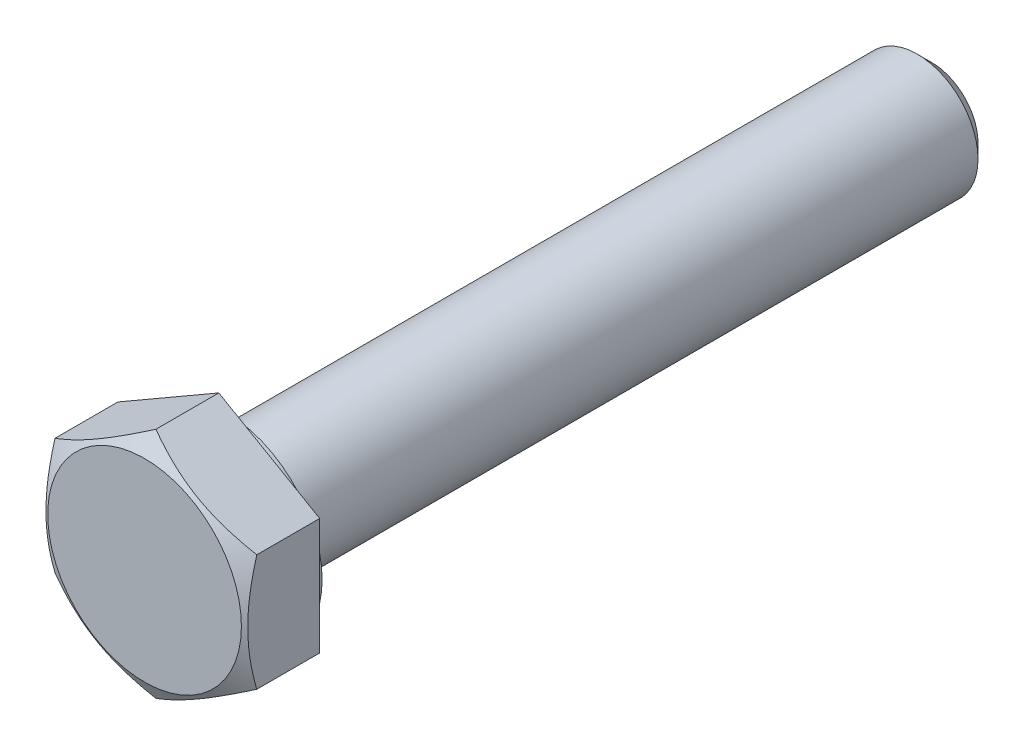
ISO-10303-21;
HEADER;
FILE_DESCRIPTION(('STEP AP214'),'2;1');
FILE_NAME('part.step','',(''),(''),'','','');
FILE_SCHEMA(('AUTOMOTIVE_DESIGN { 1 0 10303 214 1 1 1 1 }'));
ENDSEC;
DATA;
#1=APPLICATION_CONTEXT('core data for automotive mechanical design processes');
#2=APPLICATION_PROTOCOL_DEFINITION('international standard','automotive_design',2000,#1);
#3=PRODUCT_CONTEXT('',#1,'mechanical');
#4=PRODUCT('Part','Part','',(#3));
#5=PRODUCT_RELATED_PRODUCT_CATEGORY('part','',(#4));
#6=PRODUCT_DEFINITION_FORMATION('','',#4);
#7=PRODUCT_DEFINITION_CONTEXT('part definition',#1,'design');
#8=PRODUCT_DEFINITION('design','',#6,#7);
#9=PRODUCT_DEFINITION_SHAPE('','',#8);
#10=(LENGTH_UNIT() NAMED_UNIT(*) SI_UNIT(.MILLI.,.METRE.));
#11=(NAMED_UNIT(*) PLANE_ANGLE_UNIT() SI_UNIT($,.RADIAN.));
#12=(NAMED_UNIT(*) SI_UNIT($,.STERADIAN.) SOLID_ANGLE_UNIT());
#13=UNCERTAINTY_MEASURE_WITH_UNIT(LENGTH_MEASURE(1.E-05),#10,'distance_accuracy_value','');
#14=(GEOMETRIC_REPRESENTATION_CONTEXT(3) GLOBAL_UNCERTAINTY_ASSIGNED_CONTEXT((#13)) GLOBAL_UNIT_ASSIGNED_CONTEXT((#10,
#11,#12)) REPRESENTATION_CONTEXT('',''));
#15=CARTESIAN_POINT('',(0.,0.,0.));
#16=DIRECTION('',(0.,0.,1.));
#17=DIRECTION('',(1.,0.,0.));
#18=AXIS2_PLACEMENT_3D('',#15,#16,#17);
#19=CARTESIAN_POINT('',(0.,5.77350269189626,15.82));
#20=DIRECTION('',(0.,0.,1.));
#21=DIRECTION('',(1.,0.,0.));
#22=AXIS2_PLACEMENT_3D('',#19,#20,#21);
#23=PLANE('',#22);
#24=CARTESIAN_POINT('',(0.,0.,15.82));
#25=DIRECTION('',(0.,0.,1.));
#26=DIRECTION('',(1.,0.,0.));
#27=AXIS2_PLACEMENT_3D('',#24,#25,#26);
#28=CIRCLE('',#27,4.8);
#29=CARTESIAN_POINT('',(4.8,0.,15.82));
#30=VERTEX_POINT('',#29);
#31=EDGE_CURVE('E186',#30,#30,#28,.T.);
#32=ORIENTED_EDGE('',*,*,#31,.T.);
#33=EDGE_LOOP('',(#32));
#34=FACE_BOUND('',#33,.T.);
#35=DIRECTION('',(0.,1.,0.));
#36=VECTOR('',#35,1.);
#37=CARTESIAN_POINT('',(5.,5.77350269189626,15.82));
#38=LINE('',#37,#36);
#39=CARTESIAN_POINT('',(5.,-2.88675134594813,15.82));
#40=VERTEX_POINT('',#39);
#41=CARTESIAN_POINT('',(5.,2.88675134594813,15.82));
#42=VERTEX_POINT('',#41);
#43=EDGE_CURVE('E12',#40,#42,#38,.T.);
#44=ORIENTED_EDGE('',*,*,#43,.F.);
#45=DIRECTION('',(0.866025403784439,0.5,0.));
#46=VECTOR('',#45,1.);
#47=CARTESIAN_POINT('',(5.,-2.88675134594813,15.82));
#48=LINE('',#47,#46);
#49=CARTESIAN_POINT('',(0.,-5.77350269189626,15.82));
#50=VERTEX_POINT('',#49);
#51=EDGE_CURVE('E46',#50,#40,#48,.T.);
#52=ORIENTED_EDGE('',*,*,#51,.F.);
#53=DIRECTION('',(0.866025403784439,-0.5,0.));
#54=VECTOR('',#53,1.);
#55=CARTESIAN_POINT('',(-5.,-2.88675134594813,15.82));
#56=LINE('',#55,#54);
#57=CARTESIAN_POINT('',(-5.,-2.88675134594813,15.82));
#58=VERTEX_POINT('',#57);
#59=EDGE_CURVE('E108',#58,#50,#56,.T.);
#60=ORIENTED_EDGE('',*,*,#59,.F.);
#61=DIRECTION('',(0.,-1.,0.));
#62=VECTOR('',#61,1.);
#63=CARTESIAN_POINT('',(-5.,5.77350269189626,15.82));
#64=LINE('',#63,#62);
#65=CARTESIAN_POINT('',(-5.,2.88675134594813,15.82));
#66=VERTEX_POINT('',#65);
#67=EDGE_CURVE('E106',#66,#58,#64,.T.);
#68=ORIENTED_EDGE('',*,*,#67,.F.);
#69=DIRECTION('',(-0.866025403784439,-0.5,0.));
#70=VECTOR('',#69,1.);
#71=CARTESIAN_POINT('',(0.,5.77350269189626,15.82));
#72=LINE('',#71,#70);
#73=CARTESIAN_POINT('',(0.,5.77350269189626,15.82));
#74=VERTEX_POINT('',#73);
#75=EDGE_CURVE('E92',#74,#66,#72,.T.);
#76=ORIENTED_EDGE('',*,*,#75,.F.);
#77=DIRECTION('',(-0.866025403784439,0.5,0.));
#78=VECTOR('',#77,1.);
#79=CARTESIAN_POINT('',(0.,5.77350269189626,15.82));
#80=LINE('',#79,#78);
#81=EDGE_CURVE('E87',#42,#74,#80,.T.);
#82=ORIENTED_EDGE('',*,*,#81,.F.);
#83=EDGE_LOOP('',(#44,#52,#60,#68,#76,#82));
#84=FACE_BOUND('',#83,.T.);
#85=ADVANCED_FACE('F38',(#34,#84),#23,.F.);
#86=CARTESIAN_POINT('',(0.,0.,19.5));
#87=DIRECTION('',(0.,0.,1.));
#88=DIRECTION('',(1.,0.,0.));
#89=AXIS2_PLACEMENT_3D('',#86,#87,#88);
#90=CYLINDRICAL_SURFACE('',#89,4.8);
#91=ORIENTED_EDGE('',*,*,#31,.F.);
#92=EDGE_LOOP('',(#91));
#93=FACE_BOUND('',#92,.T.);
#94=CARTESIAN_POINT('',(0.,0.,15.5));
#95=DIRECTION('',(0.,0.,1.));
#96=DIRECTION('',(1.,0.,0.));
#97=AXIS2_PLACEMENT_3D('',#94,#95,#96);
#98=CIRCLE('',#97,4.8);
#99=CARTESIAN_POINT('',(4.8,0.,15.5));
#100=VERTEX_POINT('',#99);
#101=EDGE_CURVE('E183',#100,#100,#98,.T.);
#102=ORIENTED_EDGE('',*,*,#101,.T.);
#103=EDGE_LOOP('',(#102));
#104=FACE_BOUND('',#103,.T.);
#105=ADVANCED_FACE('F221',(#93,#104),#90,.T.);
#106=CARTESIAN_POINT('',(0.,4.8,15.5));
#107=DIRECTION('',(0.,0.,1.));
#108=DIRECTION('',(1.,0.,0.));
#109=AXIS2_PLACEMENT_3D('',#106,#107,#108);
#110=PLANE('',#109);
#111=ORIENTED_EDGE('',*,*,#101,.F.);
#112=EDGE_LOOP('',(#111));
#113=FACE_BOUND('',#112,.T.);
#114=CARTESIAN_POINT('',(0.,0.,15.5));
#115=DIRECTION('',(0.,0.,1.));
#116=DIRECTION('',(1.,0.,0.));
#117=AXIS2_PLACEMENT_3D('',#114,#115,#116);
#118=CIRCLE('',#117,3.);
#119=CARTESIAN_POINT('',(3.,0.,15.5));
#120=VERTEX_POINT('',#119);
#121=EDGE_CURVE('E180',#120,#120,#118,.T.);
#122=ORIENTED_EDGE('',*,*,#121,.T.);
#123=EDGE_LOOP('',(#122));
#124=FACE_BOUND('',#123,.T.);
#125=ADVANCED_FACE('F226',(#113,#124),#110,.F.);
#126=CARTESIAN_POINT('',(0.,0.,19.5));
#127=DIRECTION('',(0.,0.,1.));
#128=DIRECTION('',(1.,0.,0.));
#129=AXIS2_PLACEMENT_3D('',#126,#127,#128);
#130=CYLINDRICAL_SURFACE('',#129,3.);
#131=ORIENTED_EDGE('',*,*,#121,.F.);
#132=EDGE_LOOP('',(#131));
#133=FACE_BOUND('',#132,.T.);
#134=CARTESIAN_POINT('',(0.,0.,-18.8));
#135=DIRECTION('',(0.,0.,1.));
#136=DIRECTION('',(1.,0.,0.));
#137=AXIS2_PLACEMENT_3D('',#134,#135,#136);
#138=CIRCLE('',#137,3.);
#139=CARTESIAN_POINT('',(3.,0.,-18.8));
#140=VERTEX_POINT('',#139);
#141=EDGE_CURVE('E177',#140,#140,#138,.T.);
#142=ORIENTED_EDGE('',*,*,#141,.T.);
#143=EDGE_LOOP('',(#142));
#144=FACE_BOUND('',#143,.T.);
#145=ADVANCED_FACE('F232',(#133,#144),#130,.T.);
#146=CARTESIAN_POINT('',(0.,0.,-19.5));
#147=DIRECTION('',(0.,0.,1.));
#148=DIRECTION('',(1.,0.,0.));
#149=AXIS2_PLACEMENT_3D('',#146,#147,#148);
#150=CONICAL_SURFACE('',#149,2.29999999999999,0.785398163397453);
#151=ORIENTED_EDGE('',*,*,#141,.F.);
#152=EDGE_LOOP('',(#151));
#153=FACE_BOUND('',#152,.T.);
#154=CARTESIAN_POINT('',(0.,0.,-19.5));
#155=DIRECTION('',(0.,0.,1.));
#156=DIRECTION('',(1.,0.,0.));
#157=AXIS2_PLACEMENT_3D('',#154,#155,#156);
#158=CIRCLE('',#157,2.29999999999999);
#159=CARTESIAN_POINT('',(2.29999999999999,0.,-19.5));
#160=VERTEX_POINT('',#159);
#161=EDGE_CURVE('E167',#160,#160,#158,.T.);
#162=ORIENTED_EDGE('',*,*,#161,.T.);
#163=EDGE_LOOP('',(#162));
#164=FACE_BOUND('',#163,.T.);
#165=ADVANCED_FACE('F235',(#153,#164),#150,.T.);
#166=CARTESIAN_POINT('',(0.,2.29999999999999,-19.5));
#167=DIRECTION('',(0.,0.,1.));
#168=DIRECTION('',(1.,0.,0.));
#169=AXIS2_PLACEMENT_3D('',#166,#167,#168);
#170=PLANE('',#169);
#171=ORIENTED_EDGE('',*,*,#161,.F.);
#172=EDGE_LOOP('',(#171));
#173=FACE_BOUND('',#172,.T.);
#174=ADVANCED_FACE('F158',(#173),#170,.F.);
#175=CARTESIAN_POINT('',(5.,-2.88675134594813,-19.5));
#176=DIRECTION('',(1.,0.,0.));
#177=DIRECTION('',(0.,0.,-1.));
#178=AXIS2_PLACEMENT_3D('',#175,#176,#177);
#179=PLANE('',#178);
#180=CARTESIAN_POINT('',(5.,-7.64008573889742,16.999630377463));
#181=CARTESIAN_POINT('',(5.,-7.42068159590081,17.1055920100013));
#182=CARTESIAN_POINT('',(5.,-7.20075689313152,17.210495379141));
#183=CARTESIAN_POINT('',(5.,-6.75958482868371,17.4175804830405));
#184=CARTESIAN_POINT('',(5.,-6.53833724435119,17.5197617428973));
#185=CARTESIAN_POINT('',(5.,-6.09303477351778,17.7213393251463));
#186=CARTESIAN_POINT('',(5.,-5.86897105717839,17.8207162124602));
#187=CARTESIAN_POINT('',(5.,-5.41899608184928,18.0151783881317));
#188=CARTESIAN_POINT('',(5.,-5.19308492041238,18.1102639013854));
#189=CARTESIAN_POINT('',(5.,-4.73632589760452,18.2960998320038));
#190=CARTESIAN_POINT('',(5.,-4.50545130101547,18.3867848999223));
#191=CARTESIAN_POINT('',(5.,-4.04097325881019,18.5610125408302));
#192=CARTESIAN_POINT('',(5.,-3.80736951243133,18.6445543179996));
#193=CARTESIAN_POINT('',(5.,-3.33754668714113,18.8022389324202));
#194=CARTESIAN_POINT('',(5.,-3.10133443213912,18.8764018929248));
#195=CARTESIAN_POINT('',(5.,-2.62555260054899,19.0129099804785));
#196=CARTESIAN_POINT('',(5.,-2.38598411525087,19.0752588573439));
#197=CARTESIAN_POINT('',(5.,-1.90331981578052,19.1851032564927));
#198=CARTESIAN_POINT('',(5.,-1.66022288732634,19.2325939748645));
#199=CARTESIAN_POINT('',(5.,-1.17111612924988,19.309510832183));
#200=CARTESIAN_POINT('',(5.,-0.925106294108408,19.3389369368963));
#201=CARTESIAN_POINT('',(5.,-0.433007357321366,19.3771209931724));
#202=CARTESIAN_POINT('',(5.,-0.186928539140978,19.38600811353));
#203=CARTESIAN_POINT('',(5.,0.305030324457192,19.3826491483311));
#204=CARTESIAN_POINT('',(5.,0.550910404613565,19.3704084664303));
#205=CARTESIAN_POINT('',(5.,0.971189606769671,19.3322860132342));
#206=CARTESIAN_POINT('',(5.,1.14605416097908,19.3112666395585));
#207=CARTESIAN_POINT('',(5.,1.49442112399169,19.2599167143594));
#208=CARTESIAN_POINT('',(5.,1.66792332467769,19.2295847675469));
#209=CARTESIAN_POINT('',(5.,2.18666119826033,19.1261300000214));
#210=CARTESIAN_POINT('',(5.,2.52944904030543,19.040617691086));
#211=CARTESIAN_POINT('',(5.,3.04217461322416,18.8933052936081));
#212=CARTESIAN_POINT('',(5.,3.21479282598057,18.8403117395096));
#213=CARTESIAN_POINT('',(5.,3.55836136344024,18.729073241113));
#214=CARTESIAN_POINT('',(5.,3.72931153679484,18.670827825111));
#215=CARTESIAN_POINT('',(5.,4.06869092485971,18.5503313817446));
#216=CARTESIAN_POINT('',(5.,4.23712892703844,18.4881048549994));
#217=CARTESIAN_POINT('',(5.,4.57257364838415,18.3600688785644));
#218=CARTESIAN_POINT('',(5.,4.73958084210369,18.2942606746182));
#219=CARTESIAN_POINT('',(5.,4.90598590270293,18.2269973555927));
#220=B_SPLINE_CURVE_WITH_KNOTS('',3,(#180,#181,#182,#183,#184,#185,#186,#187,#188,#189,#190,
#191,#192,#193,#194,#195,#196,#197,#198,#199,#200,#201,#202,#203,#204,#205,#206,#207,#208,#209,
#210,#211,#212,#213,#214,#215,#216,#217,#218,#219),.UNSPECIFIED.,.F.,.F.,(4,2,2,2,2,2,2,2,2,2,2,
2,2,2,2,2,2,2,2,4),(0.,0.730964352361356,1.46205540558399,2.19735822775906,2.93262247040582,
3.67666940405851,4.42079912282938,5.16330411937892,5.90557304696753,6.64808171612084,
7.39059179236161,8.12841939633898,8.86605832117363,9.39417040541198,9.92236165454992,
10.980782885741,11.5224492040927,12.0641642215673,12.6028174369748,13.141284485932),.UNSPECIFIED.);
#221=CARTESIAN_POINT('',(5.,2.88675134594813,18.9379479587769));
#222=VERTEX_POINT('',#221);
#223=CARTESIAN_POINT('',(5.,-2.88675134594813,18.9379479587769));
#224=VERTEX_POINT('',#223);
#225=EDGE_CURVE('E125',#222,#224,#220,.F.);
#226=ORIENTED_EDGE('',*,*,#225,.T.);
#227=DIRECTION('',(0.,0.,1.));
#228=VECTOR('',#227,1.);
#229=CARTESIAN_POINT('',(5.,-2.88675134594813,-19.5));
#230=LINE('',#229,#228);
#231=EDGE_CURVE('E118',#40,#224,#230,.T.);
#232=ORIENTED_EDGE('',*,*,#231,.F.);
#233=ORIENTED_EDGE('',*,*,#43,.T.);
#234=DIRECTION('',(0.,0.,1.));
#235=VECTOR('',#234,1.);
#236=CARTESIAN_POINT('',(5.,2.88675134594813,-19.5));
#237=LINE('',#236,#235);
#238=EDGE_CURVE('E58',#42,#222,#237,.T.);
#239=ORIENTED_EDGE('',*,*,#238,.T.);
#240=EDGE_LOOP('',(#226,#232,#233,#239));
#241=FACE_BOUND('',#240,.T.);
#242=ADVANCED_FACE('F123',(#241),#179,.T.);
#243=CARTESIAN_POINT('',(0.,-5.77350269189626,-19.5));
#244=DIRECTION('',(0.5,-0.866025403784439,0.));
#245=DIRECTION('',(0.866025403784439,0.5,0.));
#246=AXIS2_PLACEMENT_3D('',#243,#244,#245);
#247=PLANE('',#246);
#248=CARTESIAN_POINT('',(5.0002,-2.88663587589429,18.9378812901102));
#249=CARTESIAN_POINT('',(4.78046540547481,-3.01349970319368,19.0111433785244));
#250=CARTESIAN_POINT('',(4.55885141554042,-3.14144859993849,19.077778624244));
#251=CARTESIAN_POINT('',(4.11178600454648,-3.39956193532121,19.1940909551513));
#252=CARTESIAN_POINT('',(3.88632664040922,-3.52973095989718,19.2437268962463));
#253=CARTESIAN_POINT('',(3.43816769477649,-3.78847564779797,19.3209789207434));
#254=CARTESIAN_POINT('',(3.2155379068958,-3.91701101576052,19.3491095678786));
#255=CARTESIAN_POINT('',(2.88081009815336,-4.11026620624322,19.3743350242084));
#256=CARTESIAN_POINT('',(2.76915780319494,-4.17472868879311,19.3799164863926));
#257=CARTESIAN_POINT('',(2.5457500293262,-4.30371322717528,19.3853277294106));
#258=CARTESIAN_POINT('',(2.43399455370968,-4.36823528110589,19.3851576879039));
#259=CARTESIAN_POINT('',(2.12781576914936,-4.54500768479194,19.37677631437));
#260=CARTESIAN_POINT('',(1.93349391403278,-4.65719946015292,19.3627001742648));
#261=CARTESIAN_POINT('',(1.54613989800229,-4.88083840557981,19.3180646890526));
#262=CARTESIAN_POINT('',(1.35310909862843,-4.9922847895602,19.2874900860146));
#263=CARTESIAN_POINT('',(0.964974657525143,-5.21637431361295,19.2110614525409));
#264=CARTESIAN_POINT('',(0.769920001358261,-5.32898917185759,19.1648835672834));
#265=CARTESIAN_POINT('',(0.382719654641229,-5.55253939626498,19.0600781516701));
#266=CARTESIAN_POINT('',(0.190569004591911,-5.66347762579591,19.0014752427247));
#267=CARTESIAN_POINT('',(-0.000200000000002914,-5.77361816195009,18.9378812901102));
#268=B_SPLINE_CURVE_WITH_KNOTS('',3,(#248,#249,#250,#251,#252,#253,#254,#255,#256,#257,#258,
#259,#260,#261,#262,#263,#264,#265,#266,#267),.UNSPECIFIED.,.F.,.F.,(4,2,2,2,2,2,2,2,2,4),(0.,
0.792555841363091,1.58701660053333,2.3618153748728,2.74884076077325,3.13585419177295,
3.80962362599679,4.48401723901189,5.17336882348928,5.86136694793725),.UNSPECIFIED.);
#269=CARTESIAN_POINT('',(0.,-5.77350269189626,18.9379479587769));
#270=VERTEX_POINT('',#269);
#271=EDGE_CURVE('E168',#224,#270,#268,.T.);
#272=ORIENTED_EDGE('',*,*,#271,.T.);
#273=DIRECTION('',(0.,0.,1.));
#274=VECTOR('',#273,1.);
#275=CARTESIAN_POINT('',(0.,-5.77350269189626,-19.5));
#276=LINE('',#275,#274);
#277=EDGE_CURVE('E121',#50,#270,#276,.T.);
#278=ORIENTED_EDGE('',*,*,#277,.F.);
#279=ORIENTED_EDGE('',*,*,#51,.T.);
#280=ORIENTED_EDGE('',*,*,#231,.T.);
#281=EDGE_LOOP('',(#272,#278,#279,#280));
#282=FACE_BOUND('',#281,.T.);
#283=ADVANCED_FACE('F117',(#282),#247,.T.);
#284=CARTESIAN_POINT('',(-5.,-2.88675134594813,-19.5));
#285=DIRECTION('',(-0.5,-0.866025403784439,0.));
#286=DIRECTION('',(0.866025403784439,-0.5,0.));
#287=AXIS2_PLACEMENT_3D('',#284,#285,#286);
#288=PLANE('',#287);
#289=CARTESIAN_POINT('',(0.000199999999997368,-5.77361816195009,18.9378812901102));
#290=CARTESIAN_POINT('',(-0.219534594525187,-5.6467543346507,19.0111433785244));
#291=CARTESIAN_POINT('',(-0.441148584459582,-5.51880543790589,19.077778624244));
#292=CARTESIAN_POINT('',(-0.888213995453515,-5.26069210252318,19.1940909551513));
#293=CARTESIAN_POINT('',(-1.11367335959078,-5.13052307794721,19.2437268962463));
#294=CARTESIAN_POINT('',(-1.56183230522351,-4.87177839004641,19.3209789207434));
#295=CARTESIAN_POINT('',(-1.78446209310419,-4.74324302208387,19.3491095678786));
#296=CARTESIAN_POINT('',(-2.11918990184664,-4.54998783160116,19.3743350242084));
#297=CARTESIAN_POINT('',(-2.23084219680506,-4.48552534905128,19.3799164863926));
#298=CARTESIAN_POINT('',(-2.4542499706738,-4.35654081066911,19.3853277294106));
#299=CARTESIAN_POINT('',(-2.56600544629031,-4.2920187567385,19.3851576879039));
#300=CARTESIAN_POINT('',(-2.87218423085064,-4.11524635305244,19.37677631437));
#301=CARTESIAN_POINT('',(-3.06650608596721,-4.00305457769146,19.3627001742648));
#302=CARTESIAN_POINT('',(-3.45386010199771,-3.77941563226457,19.3180646890526));
#303=CARTESIAN_POINT('',(-3.64689090137157,-3.66796924828418,19.2874900860146));
#304=CARTESIAN_POINT('',(-4.03502534247485,-3.44387972423144,19.2110614525409));
#305=CARTESIAN_POINT('',(-4.23007999864174,-3.3312648659868,19.1648835672834));
#306=CARTESIAN_POINT('',(-4.61728034535877,-3.1077146415794,19.0600781516701));
#307=CARTESIAN_POINT('',(-4.80943099540808,-2.99677641204847,19.0014752427247));
#308=CARTESIAN_POINT('',(-5.0002,-2.88663587589429,18.9378812901102));
#309=B_SPLINE_CURVE_WITH_KNOTS('',3,(#289,#290,#291,#292,#293,#294,#295,#296,#297,#298,#299,
#300,#301,#302,#303,#304,#305,#306,#307,#308),.UNSPECIFIED.,.F.,.F.,(4,2,2,2,2,2,2,2,2,4),(0.,
0.792555841363089,1.58701660053333,2.3618153748728,2.74884076077325,3.13585419177295,
3.80962362599679,4.48401723901189,5.17336882348928,5.86136694793725),.UNSPECIFIED.);
#310=CARTESIAN_POINT('',(-5.,-2.88675134594813,18.9379479587769));
#311=VERTEX_POINT('',#310);
#312=EDGE_CURVE('E196',#270,#311,#309,.T.);
#313=ORIENTED_EDGE('',*,*,#312,.T.);
#314=DIRECTION('',(0.,0.,1.));
#315=VECTOR('',#314,1.);
#316=CARTESIAN_POINT('',(-5.,-2.88675134594813,-19.5));
#317=LINE('',#316,#315);
#318=EDGE_CURVE('E129',#58,#311,#317,.T.);
#319=ORIENTED_EDGE('',*,*,#318,.F.);
#320=ORIENTED_EDGE('',*,*,#59,.T.);
#321=ORIENTED_EDGE('',*,*,#277,.T.);
#322=EDGE_LOOP('',(#313,#319,#320,#321));
#323=FACE_BOUND('',#322,.T.);
#324=ADVANCED_FACE('F209',(#323),#288,.T.);
#325=CARTESIAN_POINT('',(-5.,2.88675134594813,-19.5));
#326=DIRECTION('',(-1.,0.,0.));
#327=DIRECTION('',(0.,0.,1.));
#328=AXIS2_PLACEMENT_3D('',#325,#326,#327);
#329=PLANE('',#328);
#330=CARTESIAN_POINT('',(-5.,-7.64008573889742,16.999630377463));
#331=CARTESIAN_POINT('',(-5.,-7.42068159590081,17.1055920100013));
#332=CARTESIAN_POINT('',(-5.,-7.20075689313152,17.210495379141));
#333=CARTESIAN_POINT('',(-5.,-6.75958482868371,17.4175804830405));
#334=CARTESIAN_POINT('',(-5.,-6.53833724435119,17.5197617428973));
#335=CARTESIAN_POINT('',(-5.,-6.09303477351778,17.7213393251463));
#336=CARTESIAN_POINT('',(-5.,-5.86897105717839,17.8207162124602));
#337=CARTESIAN_POINT('',(-5.,-5.41899608184928,18.0151783881317));
#338=CARTESIAN_POINT('',(-5.,-5.19308492041238,18.1102639013854));
#339=CARTESIAN_POINT('',(-5.,-4.73632589760452,18.2960998320038));
#340=CARTESIAN_POINT('',(-5.,-4.50545130101547,18.3867848999223));
#341=CARTESIAN_POINT('',(-5.,-4.04097325881019,18.5610125408302));
#342=CARTESIAN_POINT('',(-5.,-3.80736951243133,18.6445543179996));
#343=CARTESIAN_POINT('',(-5.,-3.33754668714113,18.8022389324202));
#344=CARTESIAN_POINT('',(-5.,-3.10133443213912,18.8764018929248));
#345=CARTESIAN_POINT('',(-5.,-2.62555260054899,19.0129099804785));
#346=CARTESIAN_POINT('',(-5.,-2.38598411525087,19.0752588573439));
#347=CARTESIAN_POINT('',(-5.,-1.90331981578052,19.1851032564927));
#348=CARTESIAN_POINT('',(-5.,-1.66022288732634,19.2325939748645));
#349=CARTESIAN_POINT('',(-5.,-1.17111612924988,19.309510832183));
#350=CARTESIAN_POINT('',(-5.,-0.925106294108409,19.3389369368963));
#351=CARTESIAN_POINT('',(-5.,-0.433007357321367,19.3771209931724));
#352=CARTESIAN_POINT('',(-5.,-0.186928539140979,19.38600811353));
#353=CARTESIAN_POINT('',(-5.,0.305030324457191,19.3826491483311));
#354=CARTESIAN_POINT('',(-5.,0.550910404613565,19.3704084664303));
#355=CARTESIAN_POINT('',(-5.,0.971189606769672,19.3322860132342));
#356=CARTESIAN_POINT('',(-5.,1.14605416097908,19.3112666395585));
#357=CARTESIAN_POINT('',(-5.,1.4944211239917,19.2599167143594));
#358=CARTESIAN_POINT('',(-5.,1.66792332467769,19.2295847675469));
#359=CARTESIAN_POINT('',(-5.,2.18666119826033,19.1261300000214));
#360=CARTESIAN_POINT('',(-5.,2.52944904030543,19.040617691086));
#361=CARTESIAN_POINT('',(-5.,3.04217461322416,18.8933052936081));
#362=CARTESIAN_POINT('',(-5.,3.21479282598058,18.8403117395096));
#363=CARTESIAN_POINT('',(-5.,3.55836136344024,18.729073241113));
#364=CARTESIAN_POINT('',(-5.,3.72931153679485,18.670827825111));
#365=CARTESIAN_POINT('',(-5.,4.06869092485971,18.5503313817446));
#366=CARTESIAN_POINT('',(-5.,4.23712892703844,18.4881048549994));
#367=CARTESIAN_POINT('',(-5.,4.57257364838415,18.3600688785644));
#368=CARTESIAN_POINT('',(-5.,4.73958084210369,18.2942606746182));
#369=CARTESIAN_POINT('',(-5.,4.90598590270293,18.2269973555927));
#370=B_SPLINE_CURVE_WITH_KNOTS('',3,(#330,#331,#332,#333,#334,#335,#336,#337,#338,#339,#340,
#341,#342,#343,#344,#345,#346,#347,#348,#349,#350,#351,#352,#353,#354,#355,#356,#357,#358,#359,
#360,#361,#362,#363,#364,#365,#366,#367,#368,#369),.UNSPECIFIED.,.F.,.F.,(4,2,2,2,2,2,2,2,2,2,2,
2,2,2,2,2,2,2,2,4),(0.,0.730964352361357,1.46205540558399,2.19735822775906,2.93262247040582,
3.67666940405851,4.42079912282938,5.16330411937892,5.90557304696753,6.64808171612083,
7.39059179236161,8.12841939633898,8.86605832117363,9.39417040541198,9.92236165454992,
10.980782885741,11.5224492040927,12.0641642215673,12.6028174369748,13.141284485932),.UNSPECIFIED.);
#371=CARTESIAN_POINT('',(-5.,2.88675134594813,18.9379479587769));
#372=VERTEX_POINT('',#371);
#373=EDGE_CURVE('E197',#311,#372,#370,.T.);
#374=ORIENTED_EDGE('',*,*,#373,.T.);
#375=DIRECTION('',(0.,0.,1.));
#376=VECTOR('',#375,1.);
#377=CARTESIAN_POINT('',(-5.,2.88675134594813,-19.5));
#378=LINE('',#377,#376);
#379=EDGE_CURVE('E102',#66,#372,#378,.T.);
#380=ORIENTED_EDGE('',*,*,#379,.F.);
#381=ORIENTED_EDGE('',*,*,#67,.T.);
#382=ORIENTED_EDGE('',*,*,#318,.T.);
#383=EDGE_LOOP('',(#374,#380,#381,#382));
#384=FACE_BOUND('',#383,.T.);
#385=ADVANCED_FACE('F212',(#384),#329,.T.);
#386=CARTESIAN_POINT('',(0.,5.77350269189626,-19.5));
#387=DIRECTION('',(-0.5,0.866025403784439,0.));
#388=DIRECTION('',(-0.866025403784439,-0.5,0.));
#389=AXIS2_PLACEMENT_3D('',#386,#387,#388);
#390=PLANE('',#389);
#391=CARTESIAN_POINT('',(-5.0002,2.88663587589429,18.9378812901102));
#392=CARTESIAN_POINT('',(-4.78046540547481,3.01349970319368,19.0111433785244));
#393=CARTESIAN_POINT('',(-4.55885141554042,3.14144859993849,19.077778624244));
#394=CARTESIAN_POINT('',(-4.11178600454649,3.39956193532121,19.1940909551513));
#395=CARTESIAN_POINT('',(-3.88632664040922,3.52973095989718,19.2437268962463));
#396=CARTESIAN_POINT('',(-3.43816769477649,3.78847564779798,19.3209789207434));
#397=CARTESIAN_POINT('',(-3.21553790689581,3.91701101576052,19.3491095678786));
#398=CARTESIAN_POINT('',(-2.88081009815336,4.11026620624323,19.3743350242084));
#399=CARTESIAN_POINT('',(-2.76915780319494,4.17472868879311,19.3799164863926));
#400=CARTESIAN_POINT('',(-2.5457500293262,4.30371322717528,19.3853277294106));
#401=CARTESIAN_POINT('',(-2.43399455370969,4.36823528110589,19.3851576879039));
#402=CARTESIAN_POINT('',(-2.12781576914936,4.54500768479194,19.37677631437));
#403=CARTESIAN_POINT('',(-1.93349391403279,4.65719946015293,19.3627001742648));
#404=CARTESIAN_POINT('',(-1.54613989800229,4.88083840557981,19.3180646890526));
#405=CARTESIAN_POINT('',(-1.35310909862843,4.9922847895602,19.2874900860146));
#406=CARTESIAN_POINT('',(-0.964974657525145,5.21637431361295,19.2110614525409));
#407=CARTESIAN_POINT('',(-0.769920001358264,5.32898917185759,19.1648835672834));
#408=CARTESIAN_POINT('',(-0.382719654641232,5.55253939626498,19.0600781516701));
#409=CARTESIAN_POINT('',(-0.190569004591914,5.66347762579592,19.0014752427247));
#410=CARTESIAN_POINT('',(0.000200000000000741,5.7736181619501,18.9378812901102));
#411=B_SPLINE_CURVE_WITH_KNOTS('',3,(#391,#392,#393,#394,#395,#396,#397,#398,#399,#400,#401,
#402,#403,#404,#405,#406,#407,#408,#409,#410),.UNSPECIFIED.,.F.,.F.,(4,2,2,2,2,2,2,2,2,4),(0.,
0.792555841363089,1.58701660053333,2.3618153748728,2.74884076077325,3.13585419177295,
3.80962362599679,4.48401723901189,5.17336882348928,5.86136694793725),.UNSPECIFIED.);
#412=CARTESIAN_POINT('',(0.,5.77350269189626,18.9379479587769));
#413=VERTEX_POINT('',#412);
#414=EDGE_CURVE('E100',#372,#413,#411,.T.);
#415=ORIENTED_EDGE('',*,*,#414,.T.);
#416=DIRECTION('',(0.,0.,1.));
#417=VECTOR('',#416,1.);
#418=CARTESIAN_POINT('',(0.,5.77350269189626,-19.5));
#419=LINE('',#418,#417);
#420=EDGE_CURVE('E53',#74,#413,#419,.T.);
#421=ORIENTED_EDGE('',*,*,#420,.F.);
#422=ORIENTED_EDGE('',*,*,#75,.T.);
#423=ORIENTED_EDGE('',*,*,#379,.T.);
#424=EDGE_LOOP('',(#415,#421,#422,#423));
#425=FACE_BOUND('',#424,.T.);
#426=ADVANCED_FACE('F96',(#425),#390,.T.);
#427=CARTESIAN_POINT('',(5.,2.88675134594813,-19.5));
#428=DIRECTION('',(0.5,0.866025403784439,0.));
#429=DIRECTION('',(-0.866025403784439,0.5,0.));
#430=AXIS2_PLACEMENT_3D('',#427,#428,#429);
#431=PLANE('',#430);
#432=CARTESIAN_POINT('',(-0.000200000000000032,5.7736181619501,18.9378812901102));
#433=CARTESIAN_POINT('',(0.219534594525184,5.64675433465071,19.0111433785244));
#434=CARTESIAN_POINT('',(0.44114858445958,5.5188054379059,19.077778624244));
#435=CARTESIAN_POINT('',(0.888213995453512,5.26069210252318,19.1940909551513));
#436=CARTESIAN_POINT('',(1.11367335959077,5.13052307794721,19.2437268962463));
#437=CARTESIAN_POINT('',(1.56183230522351,4.87177839004641,19.3209789207434));
#438=CARTESIAN_POINT('',(1.78446209310419,4.74324302208387,19.3491095678786));
#439=CARTESIAN_POINT('',(2.11918990184664,4.54998783160116,19.3743350242084));
#440=CARTESIAN_POINT('',(2.23084219680506,4.48552534905128,19.3799164863926));
#441=CARTESIAN_POINT('',(2.4542499706738,4.35654081066911,19.3853277294106));
#442=CARTESIAN_POINT('',(2.56600544629031,4.2920187567385,19.3851576879039));
#443=CARTESIAN_POINT('',(2.87218423085064,4.11524635305244,19.37677631437));
#444=CARTESIAN_POINT('',(3.06650608596721,4.00305457769146,19.3627001742648));
#445=CARTESIAN_POINT('',(3.4538601019977,3.77941563226458,19.3180646890526));
#446=CARTESIAN_POINT('',(3.64689090137157,3.66796924828419,19.2874900860146));
#447=CARTESIAN_POINT('',(4.03502534247485,3.44387972423144,19.2110614525409));
#448=CARTESIAN_POINT('',(4.23007999864173,3.3312648659868,19.1648835672834));
#449=CARTESIAN_POINT('',(4.61728034535876,3.10771464157941,19.0600781516701));
#450=CARTESIAN_POINT('',(4.80943099540808,2.99677641204847,19.0014752427247));
#451=CARTESIAN_POINT('',(5.0002,2.88663587589429,18.9378812901102));
#452=B_SPLINE_CURVE_WITH_KNOTS('',3,(#432,#433,#434,#435,#436,#437,#438,#439,#440,#441,#442,
#443,#444,#445,#446,#447,#448,#449,#450,#451),.UNSPECIFIED.,.F.,.F.,(4,2,2,2,2,2,2,2,2,4),(0.,
0.792555841363089,1.58701660053333,2.3618153748728,2.74884076077325,3.13585419177295,
3.80962362599679,4.48401723901189,5.17336882348928,5.86136694793724),.UNSPECIFIED.);
#453=EDGE_CURVE('E126',#413,#222,#452,.T.);
#454=ORIENTED_EDGE('',*,*,#453,.T.);
#455=ORIENTED_EDGE('',*,*,#238,.F.);
#456=ORIENTED_EDGE('',*,*,#81,.T.);
#457=ORIENTED_EDGE('',*,*,#420,.T.);
#458=EDGE_LOOP('',(#454,#455,#456,#457));
#459=FACE_BOUND('',#458,.T.);
#460=ADVANCED_FACE('F88',(#459),#431,.T.);
#461=CARTESIAN_POINT('',(0.,0.,19.5));
#462=DIRECTION('',(0.,0.,-1.));
#463=DIRECTION('',(-1.,0.,0.));
#464=AXIS2_PLACEMENT_3D('',#461,#462,#463);
#465=PLANE('',#464);
#466=CARTESIAN_POINT('',(0.,0.,19.5));
#467=DIRECTION('',(0.,0.,1.));
#468=DIRECTION('',(1.,0.,0.));
#469=AXIS2_PLACEMENT_3D('',#466,#467,#468);
#470=CIRCLE('',#469,4.8);
#471=CARTESIAN_POINT('',(4.8,0.,19.5));
#472=VERTEX_POINT('',#471);
#473=EDGE_CURVE('E93',#472,#472,#470,.T.);
#474=ORIENTED_EDGE('',*,*,#473,.T.);
#475=EDGE_LOOP('',(#474));
#476=FACE_BOUND('',#475,.T.);
#477=ADVANCED_FACE('F40',(#476),#465,.F.);
#478=CARTESIAN_POINT('',(0.,0.,18.9379479587769));
#479=DIRECTION('',(0.,0.,-1.));
#480=DIRECTION('',(-1.,0.,0.));
#481=AXIS2_PLACEMENT_3D('',#478,#479,#480);
#482=CONICAL_SURFACE('',#481,5.77350269189626,1.0471975511966);
#483=ORIENTED_EDGE('',*,*,#473,.F.);
#484=EDGE_LOOP('',(#483));
#485=FACE_BOUND('',#484,.T.);
#486=ORIENTED_EDGE('',*,*,#225,.F.);
#487=ORIENTED_EDGE('',*,*,#453,.F.);
#488=ORIENTED_EDGE('',*,*,#414,.F.);
#489=ORIENTED_EDGE('',*,*,#373,.F.);
#490=ORIENTED_EDGE('',*,*,#312,.F.);
#491=ORIENTED_EDGE('',*,*,#271,.F.);
#492=EDGE_LOOP('',(#486,#487,#488,#489,#490,#491));
#493=FACE_BOUND('',#492,.T.);
#494=ADVANCED_FACE('F147',(#485,#493),#482,.T.);
#495=CLOSED_SHELL('',(#85,#105,#125,#145,#165,#174,#242,#283,#324,#385,#426,#460,#477,#494));
#496=MANIFOLD_SOLID_BREP('B2',#495);
#497=ADVANCED_BREP_SHAPE_REPRESENTATION('',(#18,#496),#14);
#498=SHAPE_DEFINITION_REPRESENTATION(#9,#497);
ENDSEC;
END-ISO-10303-21;
